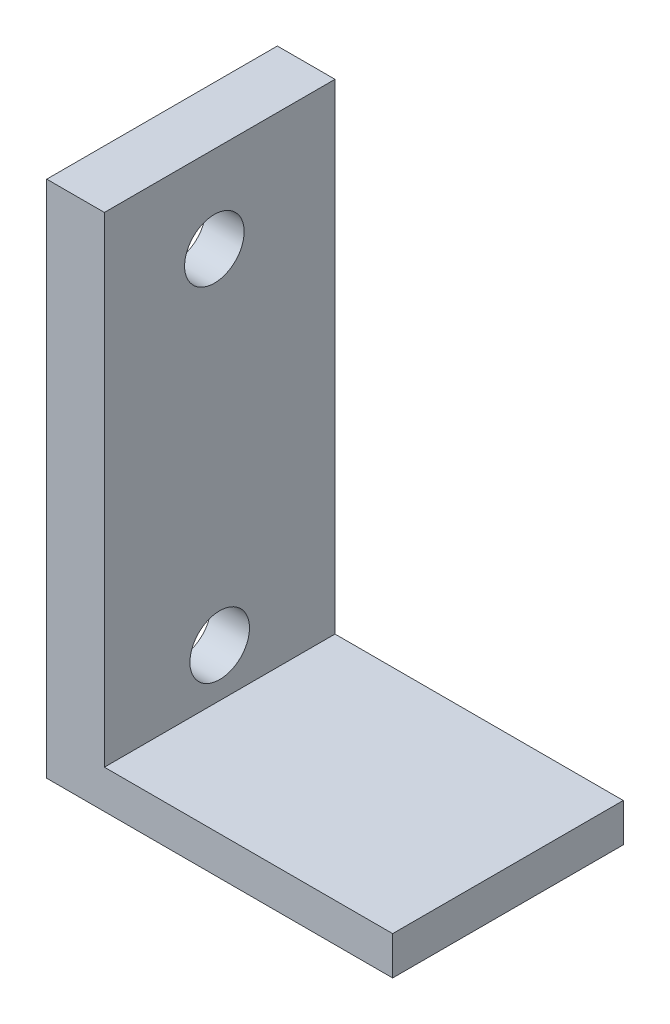
ISO-10303-21;
HEADER;
FILE_DESCRIPTION(('STEP AP214'),'2;1');
FILE_NAME('part.step','',(''),(''),'','','');
FILE_SCHEMA(('AUTOMOTIVE_DESIGN { 1 0 10303 214 1 1 1 1 }'));
ENDSEC;
DATA;
#1=APPLICATION_CONTEXT('core data for automotive mechanical design processes');
#2=APPLICATION_PROTOCOL_DEFINITION('international standard','automotive_design',2000,#1);
#3=PRODUCT_CONTEXT('',#1,'mechanical');
#4=PRODUCT('Part','Part','',(#3));
#5=PRODUCT_RELATED_PRODUCT_CATEGORY('part','',(#4));
#6=PRODUCT_DEFINITION_FORMATION('','',#4);
#7=PRODUCT_DEFINITION_CONTEXT('part definition',#1,'design');
#8=PRODUCT_DEFINITION('design','',#6,#7);
#9=PRODUCT_DEFINITION_SHAPE('','',#8);
#10=(LENGTH_UNIT() NAMED_UNIT(*) SI_UNIT(.MILLI.,.METRE.));
#11=(NAMED_UNIT(*) PLANE_ANGLE_UNIT() SI_UNIT($,.RADIAN.));
#12=(NAMED_UNIT(*) SI_UNIT($,.STERADIAN.) SOLID_ANGLE_UNIT());
#13=UNCERTAINTY_MEASURE_WITH_UNIT(LENGTH_MEASURE(1.E-05),#10,'distance_accuracy_value','');
#14=(GEOMETRIC_REPRESENTATION_CONTEXT(3) GLOBAL_UNCERTAINTY_ASSIGNED_CONTEXT((#13)) GLOBAL_UNIT_ASSIGNED_CONTEXT((#10,
#11,#12)) REPRESENTATION_CONTEXT('',''));
#15=CARTESIAN_POINT('',(0.,0.,0.));
#16=DIRECTION('',(0.,0.,1.));
#17=DIRECTION('',(1.,0.,0.));
#18=AXIS2_PLACEMENT_3D('',#15,#16,#17);
#19=CARTESIAN_POINT('',(0.,-11.962962962963,12.));
#20=DIRECTION('',(-1.,0.,0.));
#21=DIRECTION('',(0.,-1.,0.));
#22=AXIS2_PLACEMENT_3D('',#19,#20,#21);
#23=PLANE('',#22);
#24=CARTESIAN_POINT('',(0.,-9.46296296296296,6.));
#25=DIRECTION('',(1.,0.,0.));
#26=DIRECTION('',(0.,1.,0.));
#27=AXIS2_PLACEMENT_3D('',#24,#25,#26);
#28=CIRCLE('',#27,1.55);
#29=CARTESIAN_POINT('',(0.,-7.91296296296295,6.));
#30=VERTEX_POINT('',#29);
#31=EDGE_CURVE('E144',#30,#30,#28,.T.);
#32=ORIENTED_EDGE('',*,*,#31,.F.);
#33=EDGE_LOOP('',(#32));
#34=FACE_BOUND('',#33,.T.);
#35=CARTESIAN_POINT('',(0.,8.53703703703704,6.27699987588046));
#36=DIRECTION('',(-1.,0.,0.));
#37=DIRECTION('',(0.,-1.,0.));
#38=AXIS2_PLACEMENT_3D('',#35,#36,#37);
#39=CIRCLE('',#38,1.55);
#40=CARTESIAN_POINT('',(0.,6.98703703703704,6.27699987588046));
#41=VERTEX_POINT('',#40);
#42=EDGE_CURVE('E137',#41,#41,#39,.T.);
#43=ORIENTED_EDGE('',*,*,#42,.T.);
#44=EDGE_LOOP('',(#43));
#45=FACE_BOUND('',#44,.T.);
#46=DIRECTION('',(0.,1.,0.));
#47=VECTOR('',#46,1.);
#48=CARTESIAN_POINT('',(0.,-11.962962962963,0.));
#49=LINE('',#48,#47);
#50=CARTESIAN_POINT('',(0.,-11.962962962963,0.));
#51=VERTEX_POINT('',#50);
#52=CARTESIAN_POINT('',(0.,13.037037037037,0.));
#53=VERTEX_POINT('',#52);
#54=EDGE_CURVE('E119',#51,#53,#49,.T.);
#55=ORIENTED_EDGE('',*,*,#54,.T.);
#56=DIRECTION('',(0.,0.,-1.));
#57=VECTOR('',#56,1.);
#58=CARTESIAN_POINT('',(0.,13.037037037037,12.));
#59=LINE('',#58,#57);
#60=CARTESIAN_POINT('',(0.,13.037037037037,12.));
#61=VERTEX_POINT('',#60);
#62=EDGE_CURVE('E11',#61,#53,#59,.T.);
#63=ORIENTED_EDGE('',*,*,#62,.F.);
#64=DIRECTION('',(0.,1.,0.));
#65=VECTOR('',#64,1.);
#66=CARTESIAN_POINT('',(0.,-11.962962962963,12.));
#67=LINE('',#66,#65);
#68=CARTESIAN_POINT('',(0.,-11.962962962963,12.));
#69=VERTEX_POINT('',#68);
#70=EDGE_CURVE('E130',#69,#61,#67,.T.);
#71=ORIENTED_EDGE('',*,*,#70,.F.);
#72=DIRECTION('',(0.,0.,-1.));
#73=VECTOR('',#72,1.);
#74=CARTESIAN_POINT('',(0.,-11.962962962963,12.));
#75=LINE('',#74,#73);
#76=EDGE_CURVE('E115',#69,#51,#75,.T.);
#77=ORIENTED_EDGE('',*,*,#76,.T.);
#78=EDGE_LOOP('',(#55,#63,#71,#77));
#79=FACE_BOUND('',#78,.T.);
#80=ADVANCED_FACE('F33',(#34,#45,#79),#23,.F.);
#81=CARTESIAN_POINT('',(0.,13.037037037037,12.));
#82=DIRECTION('',(0.,-1.,0.));
#83=DIRECTION('',(0.,0.,-1.));
#84=AXIS2_PLACEMENT_3D('',#81,#82,#83);
#85=PLANE('',#84);
#86=DIRECTION('',(-1.,0.,0.));
#87=VECTOR('',#86,1.);
#88=CARTESIAN_POINT('',(0.,13.037037037037,0.));
#89=LINE('',#88,#87);
#90=CARTESIAN_POINT('',(-3.,13.037037037037,0.));
#91=VERTEX_POINT('',#90);
#92=EDGE_CURVE('E122',#53,#91,#89,.T.);
#93=ORIENTED_EDGE('',*,*,#92,.T.);
#94=DIRECTION('',(0.,0.,-1.));
#95=VECTOR('',#94,1.);
#96=CARTESIAN_POINT('',(-3.,13.037037037037,12.));
#97=LINE('',#96,#95);
#98=CARTESIAN_POINT('',(-3.,13.037037037037,12.));
#99=VERTEX_POINT('',#98);
#100=EDGE_CURVE('E42',#99,#91,#97,.T.);
#101=ORIENTED_EDGE('',*,*,#100,.F.);
#102=DIRECTION('',(-1.,0.,0.));
#103=VECTOR('',#102,1.);
#104=CARTESIAN_POINT('',(0.,13.037037037037,12.));
#105=LINE('',#104,#103);
#106=EDGE_CURVE('E88',#61,#99,#105,.T.);
#107=ORIENTED_EDGE('',*,*,#106,.F.);
#108=ORIENTED_EDGE('',*,*,#62,.T.);
#109=EDGE_LOOP('',(#93,#101,#107,#108));
#110=FACE_BOUND('',#109,.T.);
#111=ADVANCED_FACE('F165',(#110),#85,.F.);
#112=CARTESIAN_POINT('',(-3.,13.037037037037,12.));
#113=DIRECTION('',(1.,0.,0.));
#114=DIRECTION('',(0.,1.,0.));
#115=AXIS2_PLACEMENT_3D('',#112,#113,#114);
#116=PLANE('',#115);
#117=CARTESIAN_POINT('',(-3.,-9.46296296296295,6.05539997517609));
#118=DIRECTION('',(-1.,0.,0.));
#119=DIRECTION('',(0.,-1.,0.));
#120=AXIS2_PLACEMENT_3D('',#117,#118,#119);
#121=CIRCLE('',#120,3.5);
#122=CARTESIAN_POINT('',(-3.,-12.962962962963,6.05539997517609));
#123=VERTEX_POINT('',#122);
#124=EDGE_CURVE('E154',#123,#123,#121,.T.);
#125=ORIENTED_EDGE('',*,*,#124,.F.);
#126=EDGE_LOOP('',(#125));
#127=FACE_BOUND('',#126,.T.);
#128=CARTESIAN_POINT('',(-3.,8.53703703703704,6.27699987588046));
#129=DIRECTION('',(-1.,0.,0.));
#130=DIRECTION('',(0.,-1.,0.));
#131=AXIS2_PLACEMENT_3D('',#128,#129,#130);
#132=CIRCLE('',#131,3.5);
#133=CARTESIAN_POINT('',(-3.,5.03703703703704,6.27699987588046));
#134=VERTEX_POINT('',#133);
#135=EDGE_CURVE('E141',#134,#134,#132,.T.);
#136=ORIENTED_EDGE('',*,*,#135,.F.);
#137=EDGE_LOOP('',(#136));
#138=FACE_BOUND('',#137,.T.);
#139=DIRECTION('',(0.,-1.,0.));
#140=VECTOR('',#139,1.);
#141=CARTESIAN_POINT('',(-3.,13.037037037037,0.));
#142=LINE('',#141,#140);
#143=CARTESIAN_POINT('',(-3.,-13.962962962963,0.));
#144=VERTEX_POINT('',#143);
#145=EDGE_CURVE('E125',#91,#144,#142,.T.);
#146=ORIENTED_EDGE('',*,*,#145,.T.);
#147=DIRECTION('',(0.,0.,-1.));
#148=VECTOR('',#147,1.);
#149=CARTESIAN_POINT('',(-3.,-13.962962962963,12.));
#150=LINE('',#149,#148);
#151=CARTESIAN_POINT('',(-3.,-13.962962962963,12.));
#152=VERTEX_POINT('',#151);
#153=EDGE_CURVE('E110',#152,#144,#150,.T.);
#154=ORIENTED_EDGE('',*,*,#153,.F.);
#155=DIRECTION('',(0.,-1.,0.));
#156=VECTOR('',#155,1.);
#157=CARTESIAN_POINT('',(-3.,13.037037037037,12.));
#158=LINE('',#157,#156);
#159=EDGE_CURVE('E101',#99,#152,#158,.T.);
#160=ORIENTED_EDGE('',*,*,#159,.F.);
#161=ORIENTED_EDGE('',*,*,#100,.T.);
#162=EDGE_LOOP('',(#146,#154,#160,#161));
#163=FACE_BOUND('',#162,.T.);
#164=ADVANCED_FACE('F168',(#127,#138,#163),#116,.F.);
#165=CARTESIAN_POINT('',(-3.,-13.962962962963,12.));
#166=DIRECTION('',(0.,1.,0.));
#167=DIRECTION('',(-1.,0.,0.));
#168=AXIS2_PLACEMENT_3D('',#165,#166,#167);
#169=PLANE('',#168);
#170=DIRECTION('',(1.,0.,0.));
#171=VECTOR('',#170,1.);
#172=CARTESIAN_POINT('',(-3.,-13.962962962963,0.));
#173=LINE('',#172,#171);
#174=CARTESIAN_POINT('',(15.,-13.962962962963,0.));
#175=VERTEX_POINT('',#174);
#176=EDGE_CURVE('E109',#144,#175,#173,.T.);
#177=ORIENTED_EDGE('',*,*,#176,.T.);
#178=DIRECTION('',(0.,0.,-1.));
#179=VECTOR('',#178,1.);
#180=CARTESIAN_POINT('',(15.,-13.962962962963,12.));
#181=LINE('',#180,#179);
#182=CARTESIAN_POINT('',(15.,-13.962962962963,12.));
#183=VERTEX_POINT('',#182);
#184=EDGE_CURVE('E106',#183,#175,#181,.T.);
#185=ORIENTED_EDGE('',*,*,#184,.F.);
#186=DIRECTION('',(1.,0.,0.));
#187=VECTOR('',#186,1.);
#188=CARTESIAN_POINT('',(-3.,-13.962962962963,12.));
#189=LINE('',#188,#187);
#190=EDGE_CURVE('E95',#152,#183,#189,.T.);
#191=ORIENTED_EDGE('',*,*,#190,.F.);
#192=ORIENTED_EDGE('',*,*,#153,.T.);
#193=EDGE_LOOP('',(#177,#185,#191,#192));
#194=FACE_BOUND('',#193,.T.);
#195=ADVANCED_FACE('F107',(#194),#169,.F.);
#196=CARTESIAN_POINT('',(15.,-13.962962962963,12.));
#197=DIRECTION('',(-1.,0.,0.));
#198=DIRECTION('',(0.,-1.,0.));
#199=AXIS2_PLACEMENT_3D('',#196,#197,#198);
#200=PLANE('',#199);
#201=DIRECTION('',(0.,1.,0.));
#202=VECTOR('',#201,1.);
#203=CARTESIAN_POINT('',(15.,-13.962962962963,0.));
#204=LINE('',#203,#202);
#205=CARTESIAN_POINT('',(15.,-11.962962962963,0.));
#206=VERTEX_POINT('',#205);
#207=EDGE_CURVE('E74',#175,#206,#204,.T.);
#208=ORIENTED_EDGE('',*,*,#207,.T.);
#209=DIRECTION('',(0.,0.,-1.));
#210=VECTOR('',#209,1.);
#211=CARTESIAN_POINT('',(15.,-11.962962962963,12.));
#212=LINE('',#211,#210);
#213=CARTESIAN_POINT('',(15.,-11.962962962963,12.));
#214=VERTEX_POINT('',#213);
#215=EDGE_CURVE('E111',#214,#206,#212,.T.);
#216=ORIENTED_EDGE('',*,*,#215,.F.);
#217=DIRECTION('',(0.,1.,0.));
#218=VECTOR('',#217,1.);
#219=CARTESIAN_POINT('',(15.,-13.962962962963,12.));
#220=LINE('',#219,#218);
#221=EDGE_CURVE('E99',#183,#214,#220,.T.);
#222=ORIENTED_EDGE('',*,*,#221,.F.);
#223=ORIENTED_EDGE('',*,*,#184,.T.);
#224=EDGE_LOOP('',(#208,#216,#222,#223));
#225=FACE_BOUND('',#224,.T.);
#226=ADVANCED_FACE('F113',(#225),#200,.F.);
#227=CARTESIAN_POINT('',(15.,-11.962962962963,12.));
#228=DIRECTION('',(0.,-1.,0.));
#229=DIRECTION('',(1.,0.,0.));
#230=AXIS2_PLACEMENT_3D('',#227,#228,#229);
#231=PLANE('',#230);
#232=DIRECTION('',(-1.,0.,0.));
#233=VECTOR('',#232,1.);
#234=CARTESIAN_POINT('',(15.,-11.962962962963,0.));
#235=LINE('',#234,#233);
#236=EDGE_CURVE('E80',#206,#51,#235,.T.);
#237=ORIENTED_EDGE('',*,*,#236,.T.);
#238=ORIENTED_EDGE('',*,*,#76,.F.);
#239=DIRECTION('',(-1.,0.,0.));
#240=VECTOR('',#239,1.);
#241=CARTESIAN_POINT('',(15.,-11.962962962963,12.));
#242=LINE('',#241,#240);
#243=EDGE_CURVE('E51',#214,#69,#242,.T.);
#244=ORIENTED_EDGE('',*,*,#243,.F.);
#245=ORIENTED_EDGE('',*,*,#215,.T.);
#246=EDGE_LOOP('',(#237,#238,#244,#245));
#247=FACE_BOUND('',#246,.T.);
#248=ADVANCED_FACE('F173',(#247),#231,.F.);
#249=CARTESIAN_POINT('',(0.,0.,12.));
#250=DIRECTION('',(0.,0.,1.));
#251=DIRECTION('',(1.,0.,0.));
#252=AXIS2_PLACEMENT_3D('',#249,#250,#251);
#253=PLANE('',#252);
#254=ORIENTED_EDGE('',*,*,#70,.T.);
#255=ORIENTED_EDGE('',*,*,#106,.T.);
#256=ORIENTED_EDGE('',*,*,#159,.T.);
#257=ORIENTED_EDGE('',*,*,#190,.T.);
#258=ORIENTED_EDGE('',*,*,#221,.T.);
#259=ORIENTED_EDGE('',*,*,#243,.T.);
#260=EDGE_LOOP('',(#254,#255,#256,#257,#258,#259));
#261=FACE_BOUND('',#260,.T.);
#262=ADVANCED_FACE('F97',(#261),#253,.T.);
#263=CARTESIAN_POINT('',(0.,0.,0.));
#264=DIRECTION('',(0.,0.,1.));
#265=DIRECTION('',(1.,0.,0.));
#266=AXIS2_PLACEMENT_3D('',#263,#264,#265);
#267=PLANE('',#266);
#268=ORIENTED_EDGE('',*,*,#54,.F.);
#269=ORIENTED_EDGE('',*,*,#236,.F.);
#270=ORIENTED_EDGE('',*,*,#207,.F.);
#271=ORIENTED_EDGE('',*,*,#176,.F.);
#272=ORIENTED_EDGE('',*,*,#145,.F.);
#273=ORIENTED_EDGE('',*,*,#92,.F.);
#274=EDGE_LOOP('',(#268,#269,#270,#271,#272,#273));
#275=FACE_BOUND('',#274,.T.);
#276=ADVANCED_FACE('F171',(#275),#267,.F.);
#277=CARTESIAN_POINT('',(-2.,8.53703703703704,6.27699987588046));
#278=DIRECTION('',(-1.,0.,0.));
#279=DIRECTION('',(0.,-1.,0.));
#280=AXIS2_PLACEMENT_3D('',#277,#278,#279);
#281=CYLINDRICAL_SURFACE('',#280,3.5);
#282=CARTESIAN_POINT('',(-2.,8.53703703703704,6.27699987588046));
#283=DIRECTION('',(-1.,0.,0.));
#284=DIRECTION('',(0.,-1.,0.));
#285=AXIS2_PLACEMENT_3D('',#282,#283,#284);
#286=CIRCLE('',#285,3.5);
#287=CARTESIAN_POINT('',(-2.,5.03703703703704,6.27699987588046));
#288=VERTEX_POINT('',#287);
#289=EDGE_CURVE('E157',#288,#288,#286,.T.);
#290=ORIENTED_EDGE('',*,*,#289,.F.);
#291=EDGE_LOOP('',(#290));
#292=FACE_BOUND('',#291,.T.);
#293=ORIENTED_EDGE('',*,*,#135,.T.);
#294=EDGE_LOOP('',(#293));
#295=FACE_BOUND('',#294,.T.);
#296=ADVANCED_FACE('F211',(#292,#295),#281,.F.);
#297=CARTESIAN_POINT('',(-2.,8.53703703703704,6.27699987588046));
#298=DIRECTION('',(-1.,0.,0.));
#299=DIRECTION('',(0.,-1.,0.));
#300=AXIS2_PLACEMENT_3D('',#297,#298,#299);
#301=PLANE('',#300);
#302=CARTESIAN_POINT('',(-2.,8.53703703703704,6.27699987588046));
#303=DIRECTION('',(-1.,0.,0.));
#304=DIRECTION('',(0.,-1.,0.));
#305=AXIS2_PLACEMENT_3D('',#302,#303,#304);
#306=CIRCLE('',#305,1.55);
#307=CARTESIAN_POINT('',(-2.,6.98703703703704,6.27699987588046));
#308=VERTEX_POINT('',#307);
#309=EDGE_CURVE('E135',#308,#308,#306,.T.);
#310=ORIENTED_EDGE('',*,*,#309,.F.);
#311=EDGE_LOOP('',(#310));
#312=FACE_BOUND('',#311,.T.);
#313=ORIENTED_EDGE('',*,*,#289,.T.);
#314=EDGE_LOOP('',(#313));
#315=FACE_BOUND('',#314,.T.);
#316=ADVANCED_FACE('F207',(#312,#315),#301,.T.);
#317=CARTESIAN_POINT('',(-2.,-9.46296296296295,6.05539997517609));
#318=DIRECTION('',(-1.,0.,0.));
#319=DIRECTION('',(0.,-1.,0.));
#320=AXIS2_PLACEMENT_3D('',#317,#318,#319);
#321=CYLINDRICAL_SURFACE('',#320,3.5);
#322=CARTESIAN_POINT('',(-2.,-9.46296296296295,6.05539997517609));
#323=DIRECTION('',(-1.,0.,0.));
#324=DIRECTION('',(0.,-1.,0.));
#325=AXIS2_PLACEMENT_3D('',#322,#323,#324);
#326=CIRCLE('',#325,3.5);
#327=CARTESIAN_POINT('',(-2.,-12.962962962963,6.05539997517609));
#328=VERTEX_POINT('',#327);
#329=EDGE_CURVE('E123',#328,#328,#326,.T.);
#330=ORIENTED_EDGE('',*,*,#329,.F.);
#331=EDGE_LOOP('',(#330));
#332=FACE_BOUND('',#331,.T.);
#333=ORIENTED_EDGE('',*,*,#124,.T.);
#334=EDGE_LOOP('',(#333));
#335=FACE_BOUND('',#334,.T.);
#336=ADVANCED_FACE('F201',(#332,#335),#321,.F.);
#337=CARTESIAN_POINT('',(-2.,-9.46296296296295,6.05539997517609));
#338=DIRECTION('',(-1.,0.,0.));
#339=DIRECTION('',(0.,-1.,0.));
#340=AXIS2_PLACEMENT_3D('',#337,#338,#339);
#341=PLANE('',#340);
#342=CARTESIAN_POINT('',(-2.,-9.46296296296296,6.));
#343=DIRECTION('',(-1.,0.,0.));
#344=DIRECTION('',(0.,-1.,0.));
#345=AXIS2_PLACEMENT_3D('',#342,#343,#344);
#346=CIRCLE('',#345,1.55);
#347=CARTESIAN_POINT('',(-2.,-11.012962962963,6.));
#348=VERTEX_POINT('',#347);
#349=EDGE_CURVE('E36',#348,#348,#346,.T.);
#350=ORIENTED_EDGE('',*,*,#349,.F.);
#351=EDGE_LOOP('',(#350));
#352=FACE_BOUND('',#351,.T.);
#353=ORIENTED_EDGE('',*,*,#329,.T.);
#354=EDGE_LOOP('',(#353));
#355=FACE_BOUND('',#354,.T.);
#356=ADVANCED_FACE('F194',(#352,#355),#341,.T.);
#357=CARTESIAN_POINT('',(0.1,8.53703703703704,6.27699987588046));
#358=DIRECTION('',(-1.,0.,0.));
#359=DIRECTION('',(0.,-1.,0.));
#360=AXIS2_PLACEMENT_3D('',#357,#358,#359);
#361=CYLINDRICAL_SURFACE('',#360,1.55);
#362=CARTESIAN_POINT('',(-2.,6.98703703703704,6.27699987588046));
#363=CARTESIAN_POINT('',(-1.97916666666667,6.98703703703704,6.27699987588046));
#364=CARTESIAN_POINT('',(-1.95833333333333,6.98703703703704,6.27699987588046));
#365=CARTESIAN_POINT('',(-1.91666666666667,6.98703703703704,6.27699987588046));
#366=CARTESIAN_POINT('',(-1.89583333333333,6.98703703703704,6.27699987588046));
#367=CARTESIAN_POINT('',(-1.85416666666667,6.98703703703704,6.27699987588046));
#368=CARTESIAN_POINT('',(-1.83333333333333,6.98703703703704,6.27699987588046));
#369=CARTESIAN_POINT('',(-1.79166666666667,6.98703703703704,6.27699987588046));
#370=CARTESIAN_POINT('',(-1.77083333333333,6.98703703703704,6.27699987588046));
#371=CARTESIAN_POINT('',(-1.72916666666667,6.98703703703704,6.27699987588046));
#372=CARTESIAN_POINT('',(-1.70833333333333,6.98703703703704,6.27699987588046));
#373=CARTESIAN_POINT('',(-1.66666666666667,6.98703703703704,6.27699987588046));
#374=CARTESIAN_POINT('',(-1.64583333333333,6.98703703703704,6.27699987588046));
#375=CARTESIAN_POINT('',(-1.60416666666667,6.98703703703704,6.27699987588046));
#376=CARTESIAN_POINT('',(-1.58333333333333,6.98703703703704,6.27699987588046));
#377=CARTESIAN_POINT('',(-1.54166666666667,6.98703703703704,6.27699987588046));
#378=CARTESIAN_POINT('',(-1.52083333333333,6.98703703703704,6.27699987588046));
#379=CARTESIAN_POINT('',(-1.47916666666667,6.98703703703704,6.27699987588046));
#380=CARTESIAN_POINT('',(-1.45833333333333,6.98703703703704,6.27699987588046));
#381=CARTESIAN_POINT('',(-1.41666666666667,6.98703703703704,6.27699987588046));
#382=CARTESIAN_POINT('',(-1.39583333333333,6.98703703703704,6.27699987588046));
#383=CARTESIAN_POINT('',(-1.35416666666667,6.98703703703704,6.27699987588046));
#384=CARTESIAN_POINT('',(-1.33333333333333,6.98703703703704,6.27699987588046));
#385=CARTESIAN_POINT('',(-1.29166666666667,6.98703703703704,6.27699987588046));
#386=CARTESIAN_POINT('',(-1.27083333333333,6.98703703703704,6.27699987588046));
#387=CARTESIAN_POINT('',(-1.22916666666667,6.98703703703704,6.27699987588046));
#388=CARTESIAN_POINT('',(-1.20833333333333,6.98703703703704,6.27699987588046));
#389=CARTESIAN_POINT('',(-1.16666666666667,6.98703703703704,6.27699987588046));
#390=CARTESIAN_POINT('',(-1.14583333333333,6.98703703703704,6.27699987588046));
#391=CARTESIAN_POINT('',(-1.10416666666667,6.98703703703704,6.27699987588046));
#392=CARTESIAN_POINT('',(-1.08333333333333,6.98703703703704,6.27699987588046));
#393=CARTESIAN_POINT('',(-1.04166666666667,6.98703703703704,6.27699987588046));
#394=CARTESIAN_POINT('',(-1.02083333333333,6.98703703703704,6.27699987588046));
#395=CARTESIAN_POINT('',(-0.979166666666666,6.98703703703704,6.27699987588046));
#396=CARTESIAN_POINT('',(-0.958333333333333,6.98703703703704,6.27699987588046));
#397=CARTESIAN_POINT('',(-0.916666666666666,6.98703703703704,6.27699987588046));
#398=CARTESIAN_POINT('',(-0.895833333333333,6.98703703703704,6.27699987588046));
#399=CARTESIAN_POINT('',(-0.854166666666666,6.98703703703704,6.27699987588046));
#400=CARTESIAN_POINT('',(-0.833333333333333,6.98703703703704,6.27699987588046));
#401=CARTESIAN_POINT('',(-0.791666666666666,6.98703703703704,6.27699987588046));
#402=CARTESIAN_POINT('',(-0.770833333333333,6.98703703703704,6.27699987588046));
#403=CARTESIAN_POINT('',(-0.729166666666666,6.98703703703704,6.27699987588046));
#404=CARTESIAN_POINT('',(-0.708333333333333,6.98703703703704,6.27699987588046));
#405=CARTESIAN_POINT('',(-0.666666666666666,6.98703703703704,6.27699987588046));
#406=CARTESIAN_POINT('',(-0.645833333333333,6.98703703703704,6.27699987588046));
#407=CARTESIAN_POINT('',(-0.604166666666667,6.98703703703704,6.27699987588046));
#408=CARTESIAN_POINT('',(-0.583333333333333,6.98703703703704,6.27699987588046));
#409=CARTESIAN_POINT('',(-0.541666666666666,6.98703703703704,6.27699987588046));
#410=CARTESIAN_POINT('',(-0.520833333333333,6.98703703703704,6.27699987588046));
#411=CARTESIAN_POINT('',(-0.479166666666666,6.98703703703704,6.27699987588046));
#412=CARTESIAN_POINT('',(-0.458333333333333,6.98703703703704,6.27699987588046));
#413=CARTESIAN_POINT('',(-0.416666666666666,6.98703703703704,6.27699987588046));
#414=CARTESIAN_POINT('',(-0.395833333333333,6.98703703703704,6.27699987588046));
#415=CARTESIAN_POINT('',(-0.354166666666666,6.98703703703704,6.27699987588046));
#416=CARTESIAN_POINT('',(-0.333333333333333,6.98703703703704,6.27699987588046));
#417=CARTESIAN_POINT('',(-0.291666666666666,6.98703703703704,6.27699987588046));
#418=CARTESIAN_POINT('',(-0.270833333333333,6.98703703703704,6.27699987588046));
#419=CARTESIAN_POINT('',(-0.229166666666666,6.98703703703704,6.27699987588046));
#420=CARTESIAN_POINT('',(-0.208333333333333,6.98703703703704,6.27699987588046));
#421=CARTESIAN_POINT('',(-0.166666666666666,6.98703703703704,6.27699987588046));
#422=CARTESIAN_POINT('',(-0.145833333333333,6.98703703703704,6.27699987588046));
#423=CARTESIAN_POINT('',(-0.104166666666667,6.98703703703704,6.27699987588046));
#424=CARTESIAN_POINT('',(-0.0833333333333332,6.98703703703704,6.27699987588046));
#425=CARTESIAN_POINT('',(-0.0416666666666665,6.98703703703704,6.27699987588046));
#426=CARTESIAN_POINT('',(-0.0208333333333331,6.98703703703704,6.27699987588046));
#427=CARTESIAN_POINT('',(0.,6.98703703703704,6.27699987588046));
#428=B_SPLINE_CURVE_WITH_KNOTS('',3,(#362,#363,#364,#365,#366,#367,#368,#369,#370,#371,#372,
#373,#374,#375,#376,#377,#378,#379,#380,#381,#382,#383,#384,#385,#386,#387,#388,#389,#390,#391,
#392,#393,#394,#395,#396,#397,#398,#399,#400,#401,#402,#403,#404,#405,#406,#407,#408,#409,#410,
#411,#412,#413,#414,#415,#416,#417,#418,#419,#420,#421,#422,#423,#424,#425,#426,#427),
.UNSPECIFIED.,.F.,.F.,(4,2,2,2,2,2,2,2,2,2,2,2,2,2,2,2,2,2,2,2,2,2,2,2,2,2,2,2,2,2,2,2,4),(0.,
0.0625000000000003,0.125,0.1875,0.25,0.3125,0.375,0.4375,0.5,0.5625,0.625,0.6875,0.75,0.8125,
0.875,0.9375,1.,1.0625,1.125,1.1875,1.25,1.3125,1.375,1.4375,1.5,1.5625,1.625,1.6875,1.75,
1.8125,1.875,1.9375,2.),.UNSPECIFIED.);
#429=EDGE_CURVE('BSEAM191',#308,#41,#428,.T.);
#430=ORIENTED_EDGE('',*,*,#309,.T.);
#431=ORIENTED_EDGE('',*,*,#42,.F.);
#432=ORIENTED_EDGE('',*,*,#429,.T.);
#433=ORIENTED_EDGE('',*,*,#429,.F.);
#434=EDGE_LOOP('',(#430,#432,#431,#433));
#435=FACE_BOUND('',#434,.T.);
#436=ADVANCED_FACE('F191',(#435),#361,.F.);
#437=CARTESIAN_POINT('',(-11.,-9.46296296296296,6.));
#438=DIRECTION('',(1.,0.,0.));
#439=DIRECTION('',(0.,1.,0.));
#440=AXIS2_PLACEMENT_3D('',#437,#438,#439);
#441=CYLINDRICAL_SURFACE('',#440,1.55);
#442=ORIENTED_EDGE('',*,*,#349,.T.);
#443=EDGE_LOOP('',(#442));
#444=FACE_BOUND('',#443,.T.);
#445=ORIENTED_EDGE('',*,*,#31,.T.);
#446=EDGE_LOOP('',(#445));
#447=FACE_BOUND('',#446,.T.);
#448=ADVANCED_FACE('F193',(#444,#447),#441,.F.);
#449=CLOSED_SHELL('',(#80,#111,#164,#195,#226,#248,#262,#276,#296,#316,#336,#356,#436,#448));
#450=MANIFOLD_SOLID_BREP('B2',#449);
#451=ADVANCED_BREP_SHAPE_REPRESENTATION('',(#18,#450),#14);
#452=SHAPE_DEFINITION_REPRESENTATION(#9,#451);
ENDSEC;
END-ISO-10303-21;
